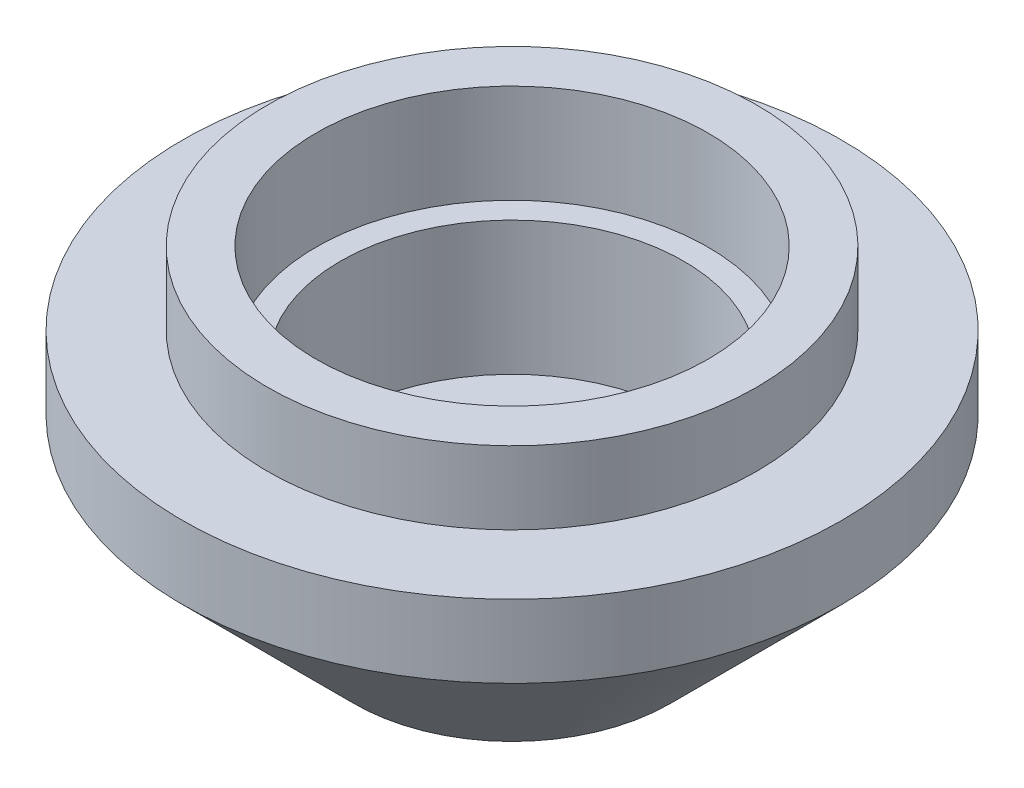
ISO-10303-21;
HEADER;
FILE_DESCRIPTION(('STEP AP214'),'2;1');
FILE_NAME('part.step','',(''),(''),'','','');
FILE_SCHEMA(('AUTOMOTIVE_DESIGN { 1 0 10303 214 1 1 1 1 }'));
ENDSEC;
DATA;
#1=APPLICATION_CONTEXT('core data for automotive mechanical design processes');
#2=APPLICATION_PROTOCOL_DEFINITION('international standard','automotive_design',2000,#1);
#3=PRODUCT_CONTEXT('',#1,'mechanical');
#4=PRODUCT('Part','Part','',(#3));
#5=PRODUCT_RELATED_PRODUCT_CATEGORY('part','',(#4));
#6=PRODUCT_DEFINITION_FORMATION('','',#4);
#7=PRODUCT_DEFINITION_CONTEXT('part definition',#1,'design');
#8=PRODUCT_DEFINITION('design','',#6,#7);
#9=PRODUCT_DEFINITION_SHAPE('','',#8);
#10=(LENGTH_UNIT() NAMED_UNIT(*) SI_UNIT(.MILLI.,.METRE.));
#11=(NAMED_UNIT(*) PLANE_ANGLE_UNIT() SI_UNIT($,.RADIAN.));
#12=(NAMED_UNIT(*) SI_UNIT($,.STERADIAN.) SOLID_ANGLE_UNIT());
#13=UNCERTAINTY_MEASURE_WITH_UNIT(LENGTH_MEASURE(1.E-05),#10,'distance_accuracy_value','');
#14=(GEOMETRIC_REPRESENTATION_CONTEXT(3) GLOBAL_UNCERTAINTY_ASSIGNED_CONTEXT((#13)) GLOBAL_UNIT_ASSIGNED_CONTEXT((#10,
#11,#12)) REPRESENTATION_CONTEXT('',''));
#15=CARTESIAN_POINT('',(0.,0.,0.));
#16=DIRECTION('',(0.,0.,1.));
#17=DIRECTION('',(1.,0.,0.));
#18=AXIS2_PLACEMENT_3D('',#15,#16,#17);
#19=CARTESIAN_POINT('',(0.,0.,0.));
#20=DIRECTION('',(0.,-1.,0.));
#21=DIRECTION('',(1.,0.,0.));
#22=AXIS2_PLACEMENT_3D('',#19,#20,#21);
#23=PLANE('',#22);
#24=CARTESIAN_POINT('',(0.,0.,0.));
#25=DIRECTION('',(0.,-1.,0.));
#26=DIRECTION('',(1.,0.,0.));
#27=AXIS2_PLACEMENT_3D('',#24,#25,#26);
#28=CIRCLE('',#27,6.5);
#29=CARTESIAN_POINT('',(6.5,0.,0.));
#30=VERTEX_POINT('',#29);
#31=EDGE_CURVE('E10',#30,#30,#28,.T.);
#32=ORIENTED_EDGE('',*,*,#31,.T.);
#33=EDGE_LOOP('',(#32));
#34=FACE_BOUND('',#33,.T.);
#35=ADVANCED_FACE('F30',(#34),#23,.T.);
#36=CARTESIAN_POINT('',(0.,0.,0.));
#37=DIRECTION('',(0.,1.,0.));
#38=DIRECTION('',(-1.,0.,0.));
#39=AXIS2_PLACEMENT_3D('',#36,#37,#38);
#40=CONICAL_SURFACE('',#39,6.5,0.785398163397446);
#41=CARTESIAN_POINT('',(0.,7.07106781186549,0.));
#42=DIRECTION('',(0.,-1.,0.));
#43=DIRECTION('',(1.,0.,0.));
#44=AXIS2_PLACEMENT_3D('',#41,#42,#43);
#45=CIRCLE('',#44,13.5710678118655);
#46=CARTESIAN_POINT('',(13.5710678118655,7.07106781186549,0.));
#47=VERTEX_POINT('',#46);
#48=EDGE_CURVE('E36',#47,#47,#45,.T.);
#49=ORIENTED_EDGE('',*,*,#48,.T.);
#50=EDGE_LOOP('',(#49));
#51=FACE_BOUND('',#50,.T.);
#52=ORIENTED_EDGE('',*,*,#31,.F.);
#53=EDGE_LOOP('',(#52));
#54=FACE_BOUND('',#53,.T.);
#55=ADVANCED_FACE('F77',(#51,#54),#40,.T.);
#56=CARTESIAN_POINT('',(0.,0.,0.));
#57=DIRECTION('',(0.,-1.,0.));
#58=DIRECTION('',(1.,0.,0.));
#59=AXIS2_PLACEMENT_3D('',#56,#57,#58);
#60=CYLINDRICAL_SURFACE('',#59,13.5710678118655);
#61=CARTESIAN_POINT('',(0.,10.0710678118655,0.));
#62=DIRECTION('',(0.,-1.,0.));
#63=DIRECTION('',(1.,0.,0.));
#64=AXIS2_PLACEMENT_3D('',#61,#62,#63);
#65=CIRCLE('',#64,13.5710678118655);
#66=CARTESIAN_POINT('',(13.5710678118655,10.0710678118655,0.));
#67=VERTEX_POINT('',#66);
#68=EDGE_CURVE('E40',#67,#67,#65,.T.);
#69=ORIENTED_EDGE('',*,*,#68,.T.);
#70=EDGE_LOOP('',(#69));
#71=FACE_BOUND('',#70,.T.);
#72=ORIENTED_EDGE('',*,*,#48,.F.);
#73=EDGE_LOOP('',(#72));
#74=FACE_BOUND('',#73,.T.);
#75=ADVANCED_FACE('F81',(#71,#74),#60,.T.);
#76=CARTESIAN_POINT('',(13.5710678118655,10.0710678118655,0.));
#77=DIRECTION('',(0.,1.,0.));
#78=DIRECTION('',(-1.,0.,0.));
#79=AXIS2_PLACEMENT_3D('',#76,#77,#78);
#80=PLANE('',#79);
#81=CARTESIAN_POINT('',(0.,10.0710678118655,0.));
#82=DIRECTION('',(0.,-1.,0.));
#83=DIRECTION('',(1.,0.,0.));
#84=AXIS2_PLACEMENT_3D('',#81,#82,#83);
#85=CIRCLE('',#84,10.0710678118655);
#86=CARTESIAN_POINT('',(10.0710678118655,10.0710678118655,0.));
#87=VERTEX_POINT('',#86);
#88=EDGE_CURVE('E44',#87,#87,#85,.T.);
#89=ORIENTED_EDGE('',*,*,#88,.T.);
#90=EDGE_LOOP('',(#89));
#91=FACE_BOUND('',#90,.T.);
#92=ORIENTED_EDGE('',*,*,#68,.F.);
#93=EDGE_LOOP('',(#92));
#94=FACE_BOUND('',#93,.T.);
#95=ADVANCED_FACE('F85',(#91,#94),#80,.T.);
#96=CARTESIAN_POINT('',(0.,0.,0.));
#97=DIRECTION('',(0.,-1.,0.));
#98=DIRECTION('',(1.,0.,0.));
#99=AXIS2_PLACEMENT_3D('',#96,#97,#98);
#100=CYLINDRICAL_SURFACE('',#99,10.0710678118655);
#101=CARTESIAN_POINT('',(0.,13.0710678118655,0.));
#102=DIRECTION('',(0.,-1.,0.));
#103=DIRECTION('',(1.,0.,0.));
#104=AXIS2_PLACEMENT_3D('',#101,#102,#103);
#105=CIRCLE('',#104,10.0710678118655);
#106=CARTESIAN_POINT('',(10.0710678118655,13.0710678118655,0.));
#107=VERTEX_POINT('',#106);
#108=EDGE_CURVE('E49',#107,#107,#105,.T.);
#109=ORIENTED_EDGE('',*,*,#108,.T.);
#110=EDGE_LOOP('',(#109));
#111=FACE_BOUND('',#110,.T.);
#112=ORIENTED_EDGE('',*,*,#88,.F.);
#113=EDGE_LOOP('',(#112));
#114=FACE_BOUND('',#113,.T.);
#115=ADVANCED_FACE('F92',(#111,#114),#100,.T.);
#116=CARTESIAN_POINT('',(10.0710678118655,13.0710678118655,0.));
#117=DIRECTION('',(0.,1.,0.));
#118=DIRECTION('',(-1.,0.,0.));
#119=AXIS2_PLACEMENT_3D('',#116,#117,#118);
#120=PLANE('',#119);
#121=CARTESIAN_POINT('',(0.,13.0710678118655,0.));
#122=DIRECTION('',(0.,-1.,0.));
#123=DIRECTION('',(1.,0.,0.));
#124=AXIS2_PLACEMENT_3D('',#121,#122,#123);
#125=CIRCLE('',#124,8.07106781186546);
#126=CARTESIAN_POINT('',(8.07106781186546,13.0710678118655,0.));
#127=VERTEX_POINT('',#126);
#128=EDGE_CURVE('E52',#127,#127,#125,.T.);
#129=ORIENTED_EDGE('',*,*,#128,.T.);
#130=EDGE_LOOP('',(#129));
#131=FACE_BOUND('',#130,.T.);
#132=ORIENTED_EDGE('',*,*,#108,.F.);
#133=EDGE_LOOP('',(#132));
#134=FACE_BOUND('',#133,.T.);
#135=ADVANCED_FACE('F96',(#131,#134),#120,.T.);
#136=CARTESIAN_POINT('',(0.,0.,0.));
#137=DIRECTION('',(0.,-1.,0.));
#138=DIRECTION('',(1.,0.,0.));
#139=AXIS2_PLACEMENT_3D('',#136,#137,#138);
#140=CYLINDRICAL_SURFACE('',#139,8.07106781186546);
#141=CARTESIAN_POINT('',(0.,9.,0.));
#142=DIRECTION('',(0.,-1.,0.));
#143=DIRECTION('',(1.,0.,0.));
#144=AXIS2_PLACEMENT_3D('',#141,#142,#143);
#145=CIRCLE('',#144,8.07106781186546);
#146=CARTESIAN_POINT('',(8.07106781186546,9.,0.));
#147=VERTEX_POINT('',#146);
#148=EDGE_CURVE('E55',#147,#147,#145,.T.);
#149=ORIENTED_EDGE('',*,*,#148,.T.);
#150=EDGE_LOOP('',(#149));
#151=FACE_BOUND('',#150,.T.);
#152=ORIENTED_EDGE('',*,*,#128,.F.);
#153=EDGE_LOOP('',(#152));
#154=FACE_BOUND('',#153,.T.);
#155=ADVANCED_FACE('F100',(#151,#154),#140,.F.);
#156=CARTESIAN_POINT('',(8.07106781186546,9.,0.));
#157=DIRECTION('',(0.,1.,0.));
#158=DIRECTION('',(-1.,0.,0.));
#159=AXIS2_PLACEMENT_3D('',#156,#157,#158);
#160=PLANE('',#159);
#161=CARTESIAN_POINT('',(0.,9.,0.));
#162=DIRECTION('',(0.,-1.,0.));
#163=DIRECTION('',(1.,0.,0.));
#164=AXIS2_PLACEMENT_3D('',#161,#162,#163);
#165=CIRCLE('',#164,7.07106781186546);
#166=CARTESIAN_POINT('',(7.07106781186546,9.,0.));
#167=VERTEX_POINT('',#166);
#168=EDGE_CURVE('E58',#167,#167,#165,.T.);
#169=ORIENTED_EDGE('',*,*,#168,.T.);
#170=EDGE_LOOP('',(#169));
#171=FACE_BOUND('',#170,.T.);
#172=ORIENTED_EDGE('',*,*,#148,.F.);
#173=EDGE_LOOP('',(#172));
#174=FACE_BOUND('',#173,.T.);
#175=ADVANCED_FACE('F74',(#171,#174),#160,.T.);
#176=CARTESIAN_POINT('',(0.,0.,0.));
#177=DIRECTION('',(0.,-1.,0.));
#178=DIRECTION('',(1.,0.,0.));
#179=AXIS2_PLACEMENT_3D('',#176,#177,#178);
#180=CYLINDRICAL_SURFACE('',#179,7.07106781186546);
#181=CARTESIAN_POINT('',(0.,3.5,0.));
#182=DIRECTION('',(0.,-1.,0.));
#183=DIRECTION('',(1.,0.,0.));
#184=AXIS2_PLACEMENT_3D('',#181,#182,#183);
#185=CIRCLE('',#184,7.07106781186546);
#186=CARTESIAN_POINT('',(7.07106781186546,3.5,0.));
#187=VERTEX_POINT('',#186);
#188=EDGE_CURVE('E61',#187,#187,#185,.T.);
#189=ORIENTED_EDGE('',*,*,#188,.T.);
#190=EDGE_LOOP('',(#189));
#191=FACE_BOUND('',#190,.T.);
#192=ORIENTED_EDGE('',*,*,#168,.F.);
#193=EDGE_LOOP('',(#192));
#194=FACE_BOUND('',#193,.T.);
#195=ADVANCED_FACE('F65',(#191,#194),#180,.F.);
#196=CARTESIAN_POINT('',(7.07106781186546,3.5,0.));
#197=DIRECTION('',(0.,1.,0.));
#198=DIRECTION('',(-1.,0.,0.));
#199=AXIS2_PLACEMENT_3D('',#196,#197,#198);
#200=PLANE('',#199);
#201=ORIENTED_EDGE('',*,*,#188,.F.);
#202=EDGE_LOOP('',(#201));
#203=FACE_BOUND('',#202,.T.);
#204=ADVANCED_FACE('F68',(#203),#200,.T.);
#205=CLOSED_SHELL('',(#35,#55,#75,#95,#115,#135,#155,#175,#195,#204));
#206=MANIFOLD_SOLID_BREP('B2',#205);
#207=ADVANCED_BREP_SHAPE_REPRESENTATION('',(#18,#206),#14);
#208=SHAPE_DEFINITION_REPRESENTATION(#9,#207);
ENDSEC;
END-ISO-10303-21;
